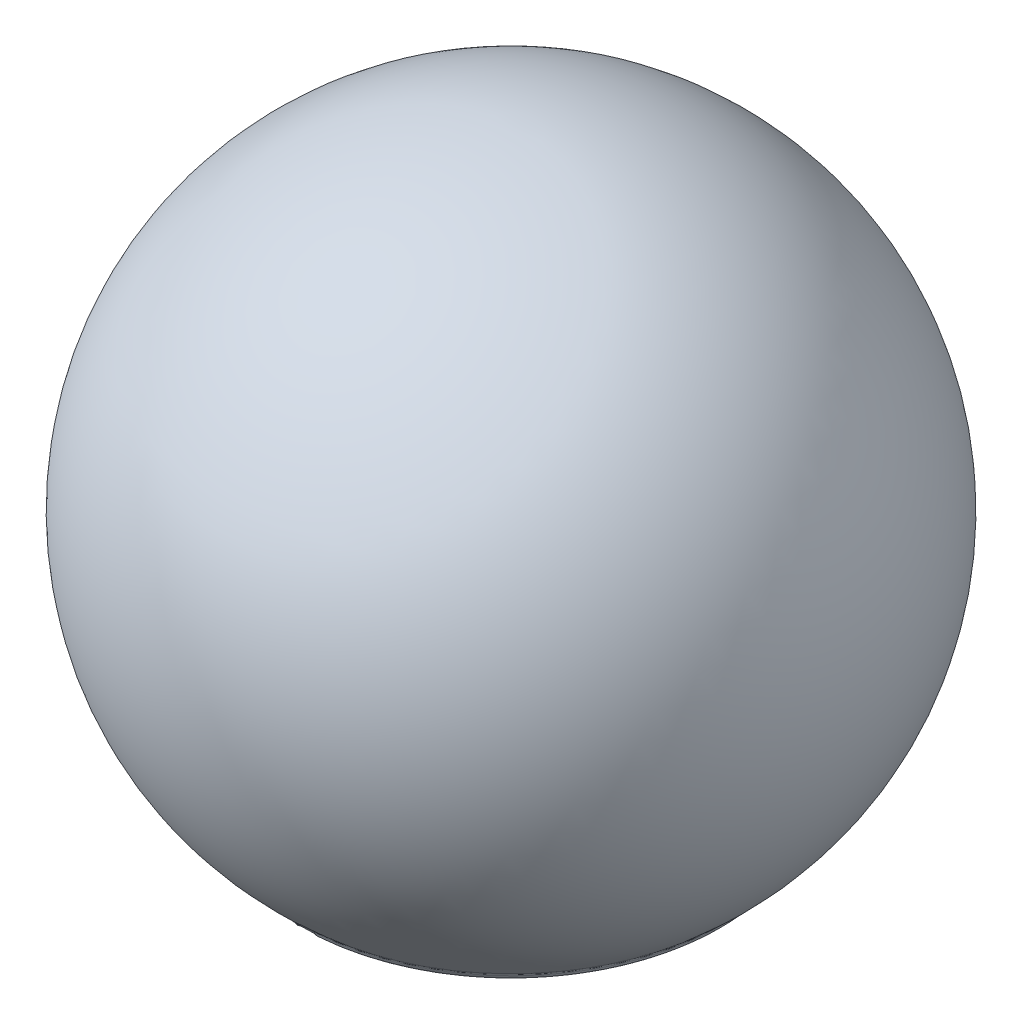
ISO-10303-21;
HEADER;
FILE_DESCRIPTION(('STEP AP214'),'2;1');
FILE_NAME('part.step','',(''),(''),'','','');
FILE_SCHEMA(('AUTOMOTIVE_DESIGN { 1 0 10303 214 1 1 1 1 }'));
ENDSEC;
DATA;
#1=APPLICATION_CONTEXT('core data for automotive mechanical design processes');
#2=APPLICATION_PROTOCOL_DEFINITION('international standard','automotive_design',2000,#1);
#3=PRODUCT_CONTEXT('',#1,'mechanical');
#4=PRODUCT('Part','Part','',(#3));
#5=PRODUCT_RELATED_PRODUCT_CATEGORY('part','',(#4));
#6=PRODUCT_DEFINITION_FORMATION('','',#4);
#7=PRODUCT_DEFINITION_CONTEXT('part definition',#1,'design');
#8=PRODUCT_DEFINITION('design','',#6,#7);
#9=PRODUCT_DEFINITION_SHAPE('','',#8);
#10=(LENGTH_UNIT() NAMED_UNIT(*) SI_UNIT(.MILLI.,.METRE.));
#11=(NAMED_UNIT(*) PLANE_ANGLE_UNIT() SI_UNIT($,.RADIAN.));
#12=(NAMED_UNIT(*) SI_UNIT($,.STERADIAN.) SOLID_ANGLE_UNIT());
#13=UNCERTAINTY_MEASURE_WITH_UNIT(LENGTH_MEASURE(1.E-05),#10,'distance_accuracy_value','');
#14=(GEOMETRIC_REPRESENTATION_CONTEXT(3) GLOBAL_UNCERTAINTY_ASSIGNED_CONTEXT((#13)) GLOBAL_UNIT_ASSIGNED_CONTEXT((#10,
#11,#12)) REPRESENTATION_CONTEXT('',''));
#15=CARTESIAN_POINT('',(0.,0.,0.));
#16=DIRECTION('',(0.,0.,1.));
#17=DIRECTION('',(1.,0.,0.));
#18=AXIS2_PLACEMENT_3D('',#15,#16,#17);
#19=CARTESIAN_POINT('',(0.,0.,0.));
#20=DIRECTION('',(0.,1.,0.));
#21=DIRECTION('',(1.,0.,0.));
#22=AXIS2_PLACEMENT_3D('',#19,#20,#21);
#23=SPHERICAL_SURFACE('',#22,73.175);
#24=CARTESIAN_POINT('',(0.,-56.922737924471,0.));
#25=DIRECTION('',(0.,1.,0.));
#26=DIRECTION('',(-1.,0.,0.));
#27=AXIS2_PLACEMENT_3D('',#24,#25,#26);
#28=CIRCLE('',#27,45.9824154670238);
#29=CARTESIAN_POINT('',(-45.9824154670237,-56.922737924471,0.));
#30=VERTEX_POINT('',#29);
#31=EDGE_CURVE('E10',#30,#30,#28,.F.);
#32=ORIENTED_EDGE('',*,*,#31,.T.);
#33=EDGE_LOOP('',(#32));
#34=FACE_BOUND('',#33,.T.);
#35=ADVANCED_FACE('F32',(#34),#23,.F.);
#36=CARTESIAN_POINT('',(47.9208983638663,-58.8685453885664,0.));
#37=DIRECTION('',(0.,1.,0.));
#38=DIRECTION('',(-1.,0.,0.));
#39=AXIS2_PLACEMENT_3D('',#36,#37,#38);
#40=PLANE('',#39);
#41=CARTESIAN_POINT('',(0.,-58.8685453885664,0.));
#42=DIRECTION('',(0.,1.,0.));
#43=DIRECTION('',(-1.,0.,0.));
#44=AXIS2_PLACEMENT_3D('',#41,#42,#43);
#45=CIRCLE('',#44,46.4208983638663);
#46=CARTESIAN_POINT('',(-46.4208983638662,-58.8685453885664,0.));
#47=VERTEX_POINT('',#46);
#48=EDGE_CURVE('E52',#47,#47,#45,.F.);
#49=ORIENTED_EDGE('',*,*,#48,.T.);
#50=EDGE_LOOP('',(#49));
#51=FACE_BOUND('',#50,.T.);
#52=CARTESIAN_POINT('',(0.,-58.8685453885664,0.));
#53=DIRECTION('',(0.,1.,0.));
#54=DIRECTION('',(-1.,0.,0.));
#55=AXIS2_PLACEMENT_3D('',#52,#53,#54);
#56=CIRCLE('',#55,45.425);
#57=CARTESIAN_POINT('',(-45.425,-58.8685453885664,0.));
#58=VERTEX_POINT('',#57);
#59=EDGE_CURVE('E55',#58,#58,#56,.T.);
#60=ORIENTED_EDGE('',*,*,#59,.T.);
#61=EDGE_LOOP('',(#60));
#62=FACE_BOUND('',#61,.T.);
#63=ADVANCED_FACE('F59',(#51,#62),#40,.F.);
#64=CARTESIAN_POINT('',(0.,-73.175,0.));
#65=DIRECTION('',(0.,1.,0.));
#66=DIRECTION('',(-1.,0.,0.));
#67=AXIS2_PLACEMENT_3D('',#64,#65,#66);
#68=CYLINDRICAL_SURFACE('',#67,45.425);
#69=CARTESIAN_POINT('',(0.,-58.0895859857858,0.));
#70=DIRECTION('',(0.,1.,0.));
#71=DIRECTION('',(-1.,0.,0.));
#72=AXIS2_PLACEMENT_3D('',#69,#70,#71);
#73=CIRCLE('',#72,45.425);
#74=CARTESIAN_POINT('',(-45.425,-58.0895859857858,0.));
#75=VERTEX_POINT('',#74);
#76=EDGE_CURVE('E39',#75,#75,#73,.T.);
#77=ORIENTED_EDGE('',*,*,#76,.T.);
#78=EDGE_LOOP('',(#77));
#79=FACE_BOUND('',#78,.T.);
#80=ORIENTED_EDGE('',*,*,#59,.F.);
#81=EDGE_LOOP('',(#80));
#82=FACE_BOUND('',#81,.T.);
#83=ADVANCED_FACE('F61',(#79,#82),#68,.F.);
#84=CARTESIAN_POINT('',(0.,0.,0.));
#85=DIRECTION('',(0.,1.,0.));
#86=DIRECTION('',(-1.,0.,0.));
#87=AXIS2_PLACEMENT_3D('',#84,#85,#86);
#88=SPHERICAL_SURFACE('',#87,74.75);
#89=CARTESIAN_POINT('',(0.,-57.0108876749663,0.));
#90=DIRECTION('',(0.,1.,0.));
#91=DIRECTION('',(-1.,0.,0.));
#92=AXIS2_PLACEMENT_3D('',#89,#90,#91);
#93=CIRCLE('',#92,48.3458497341021);
#94=CARTESIAN_POINT('',(-48.3458497341021,-57.0108876749663,0.));
#95=VERTEX_POINT('',#94);
#96=EDGE_CURVE('E47',#95,#95,#93,.T.);
#97=ORIENTED_EDGE('',*,*,#96,.T.);
#98=EDGE_LOOP('',(#97));
#99=FACE_BOUND('',#98,.T.);
#100=ADVANCED_FACE('F63',(#99),#88,.T.);
#101=CARTESIAN_POINT('',(0.,-57.3685453885664,0.));
#102=DIRECTION('',(0.,1.,0.));
#103=DIRECTION('',(-1.,0.,0.));
#104=AXIS2_PLACEMENT_3D('',#101,#102,#103);
#105=TOROIDAL_SURFACE('',#104,46.4208983638663,1.5);
#106=CARTESIAN_POINT('',(0.,-57.7617321271673,0.));
#107=DIRECTION('',(0.,1.,0.));
#108=DIRECTION('',(-1.,0.,0.));
#109=AXIS2_PLACEMENT_3D('',#106,#107,#108);
#110=CIRCLE('',#109,47.8684494643764);
#111=CARTESIAN_POINT('',(-47.8684494643764,-57.7617321271673,0.));
#112=VERTEX_POINT('',#111);
#113=EDGE_CURVE('E43',#112,#112,#110,.F.);
#114=ORIENTED_EDGE('',*,*,#113,.T.);
#115=EDGE_LOOP('',(#114));
#116=FACE_BOUND('',#115,.T.);
#117=ORIENTED_EDGE('',*,*,#48,.F.);
#118=EDGE_LOOP('',(#117));
#119=FACE_BOUND('',#118,.T.);
#120=ADVANCED_FACE('F69',(#116,#119),#105,.T.);
#121=CARTESIAN_POINT('',(0.,-58.1549188657683,0.));
#122=DIRECTION('',(0.,1.,0.));
#123=DIRECTION('',(-1.,0.,0.));
#124=AXIS2_PLACEMENT_3D('',#121,#122,#123);
#125=TOROIDAL_SURFACE('',#124,49.3160005648868,1.5);
#126=ORIENTED_EDGE('',*,*,#113,.F.);
#127=EDGE_LOOP('',(#126));
#128=FACE_BOUND('',#127,.T.);
#129=ORIENTED_EDGE('',*,*,#96,.F.);
#130=EDGE_LOOP('',(#129));
#131=FACE_BOUND('',#130,.T.);
#132=ADVANCED_FACE('F80',(#128,#131),#125,.F.);
#133=CARTESIAN_POINT('',(0.,-58.0895859857858,0.));
#134=DIRECTION('',(0.,1.,0.));
#135=DIRECTION('',(-1.,0.,0.));
#136=AXIS2_PLACEMENT_3D('',#133,#134,#135);
#137=TOROIDAL_SURFACE('',#136,46.925,1.5);
#138=ORIENTED_EDGE('',*,*,#31,.F.);
#139=EDGE_LOOP('',(#138));
#140=FACE_BOUND('',#139,.T.);
#141=ORIENTED_EDGE('',*,*,#76,.F.);
#142=EDGE_LOOP('',(#141));
#143=FACE_BOUND('',#142,.T.);
#144=ADVANCED_FACE('F34',(#140,#143),#137,.T.);
#145=CLOSED_SHELL('',(#35,#63,#83,#100,#120,#132,#144));
#146=MANIFOLD_SOLID_BREP('B2',#145);
#147=ADVANCED_BREP_SHAPE_REPRESENTATION('',(#18,#146),#14);
#148=SHAPE_DEFINITION_REPRESENTATION(#9,#147);
ENDSEC;
END-ISO-10303-21;
